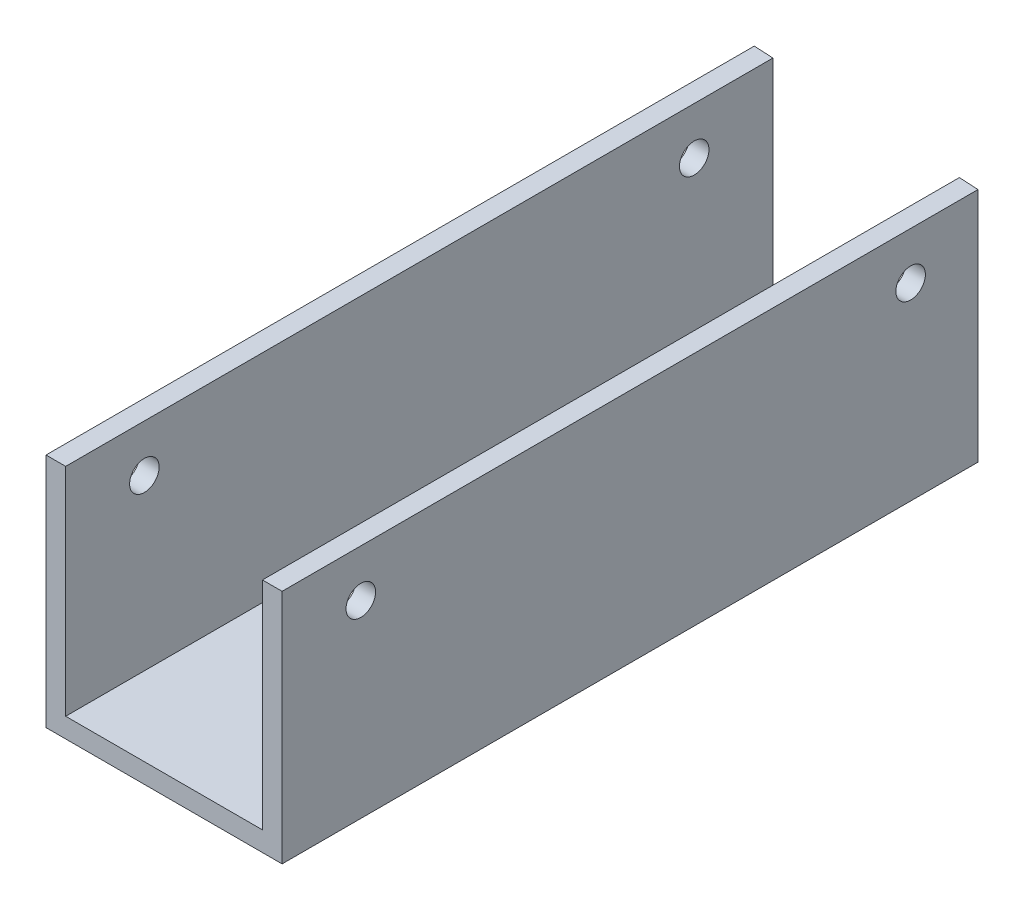
ISO-10303-21;
HEADER;
FILE_DESCRIPTION(('STEP AP214'),'2;1');
FILE_NAME('part.step','',(''),(''),'','','');
FILE_SCHEMA(('AUTOMOTIVE_DESIGN { 1 0 10303 214 1 1 1 1 }'));
ENDSEC;
DATA;
#1=APPLICATION_CONTEXT('core data for automotive mechanical design processes');
#2=APPLICATION_PROTOCOL_DEFINITION('international standard','automotive_design',2000,#1);
#3=PRODUCT_CONTEXT('',#1,'mechanical');
#4=PRODUCT('Part','Part','',(#3));
#5=PRODUCT_RELATED_PRODUCT_CATEGORY('part','',(#4));
#6=PRODUCT_DEFINITION_FORMATION('','',#4);
#7=PRODUCT_DEFINITION_CONTEXT('part definition',#1,'design');
#8=PRODUCT_DEFINITION('design','',#6,#7);
#9=PRODUCT_DEFINITION_SHAPE('','',#8);
#10=(LENGTH_UNIT() NAMED_UNIT(*) SI_UNIT(.MILLI.,.METRE.));
#11=(NAMED_UNIT(*) PLANE_ANGLE_UNIT() SI_UNIT($,.RADIAN.));
#12=(NAMED_UNIT(*) SI_UNIT($,.STERADIAN.) SOLID_ANGLE_UNIT());
#13=UNCERTAINTY_MEASURE_WITH_UNIT(LENGTH_MEASURE(1.E-05),#10,'distance_accuracy_value','');
#14=(GEOMETRIC_REPRESENTATION_CONTEXT(3) GLOBAL_UNCERTAINTY_ASSIGNED_CONTEXT((#13)) GLOBAL_UNIT_ASSIGNED_CONTEXT((#10,
#11,#12)) REPRESENTATION_CONTEXT('',''));
#15=CARTESIAN_POINT('',(0.,0.,0.));
#16=DIRECTION('',(0.,0.,1.));
#17=DIRECTION('',(1.,0.,0.));
#18=AXIS2_PLACEMENT_3D('',#15,#16,#17);
#19=CARTESIAN_POINT('',(-16.5537585091626,3.175,114.3));
#20=DIRECTION('',(0.,-1.,0.));
#21=DIRECTION('',(0.,0.,-1.));
#22=AXIS2_PLACEMENT_3D('',#19,#20,#21);
#23=PLANE('',#22);
#24=DIRECTION('',(0.,0.,-1.));
#25=VECTOR('',#24,1.);
#26=CARTESIAN_POINT('',(-16.5537585091626,3.175,114.3));
#27=LINE('',#26,#25);
#28=CARTESIAN_POINT('',(-16.5537585091626,3.175,68.2625));
#29=VERTEX_POINT('',#28);
#30=CARTESIAN_POINT('',(-16.5537585091626,3.175,0.166394699223652));
#31=VERTEX_POINT('',#30);
#32=EDGE_CURVE('E234',#29,#31,#27,.T.);
#33=ORIENTED_EDGE('',*,*,#32,.F.);
#34=DIRECTION('',(-1.,0.,0.));
#35=VECTOR('',#34,1.);
#36=CARTESIAN_POINT('',(-16.5537585091627,3.175,68.2625));
#37=LINE('',#36,#35);
#38=CARTESIAN_POINT('',(15.1962414908374,3.175,68.2625));
#39=VERTEX_POINT('',#38);
#40=EDGE_CURVE('E56',#39,#29,#37,.T.);
#41=ORIENTED_EDGE('',*,*,#40,.F.);
#42=DIRECTION('',(0.,0.,-1.));
#43=VECTOR('',#42,1.);
#44=CARTESIAN_POINT('',(15.1962414908374,3.175,114.3));
#45=LINE('',#44,#43);
#46=CARTESIAN_POINT('',(15.1962414908373,3.175,1.83034169145998));
#47=VERTEX_POINT('',#46);
#48=EDGE_CURVE('E236',#39,#47,#45,.T.);
#49=ORIENTED_EDGE('',*,*,#48,.T.);
#50=DIRECTION('',(-0.998629534754574,0.,-0.0523359562429369));
#51=VECTOR('',#50,1.);
#52=CARTESIAN_POINT('',(-10.5886533245199,3.175,0.479012615140481));
#53=LINE('',#52,#51);
#54=EDGE_CURVE('E196',#47,#31,#53,.T.);
#55=ORIENTED_EDGE('',*,*,#54,.T.);
#56=EDGE_LOOP('',(#33,#41,#49,#55));
#57=FACE_BOUND('',#56,.T.);
#58=ADVANCED_FACE('F39',(#57),#23,.F.);
#59=CARTESIAN_POINT('',(18.3712414908373,38.1,114.3));
#60=DIRECTION('',(-1.,0.,0.));
#61=DIRECTION('',(0.,-1.,0.));
#62=AXIS2_PLACEMENT_3D('',#59,#60,#61);
#63=PLANE('',#62);
#64=CARTESIAN_POINT('',(18.3712414908373,30.48,12.8663946992236));
#65=DIRECTION('',(1.,0.,0.));
#66=DIRECTION('',(0.,1.,0.));
#67=AXIS2_PLACEMENT_3D('',#64,#65,#66);
#68=CIRCLE('',#67,2.38125);
#69=CARTESIAN_POINT('',(18.3712414908373,32.86125,12.8663946992236));
#70=VERTEX_POINT('',#69);
#71=EDGE_CURVE('E166',#70,#70,#68,.T.);
#72=ORIENTED_EDGE('',*,*,#71,.F.);
#73=EDGE_LOOP('',(#72));
#74=FACE_BOUND('',#73,.T.);
#75=CARTESIAN_POINT('',(18.3712414908373,30.48,101.6));
#76=DIRECTION('',(1.,0.,0.));
#77=DIRECTION('',(0.,1.,0.));
#78=AXIS2_PLACEMENT_3D('',#75,#76,#77);
#79=CIRCLE('',#78,2.38125000000001);
#80=CARTESIAN_POINT('',(18.3712414908373,32.86125,101.6));
#81=VERTEX_POINT('',#80);
#82=EDGE_CURVE('E162',#81,#81,#79,.T.);
#83=ORIENTED_EDGE('',*,*,#82,.F.);
#84=EDGE_LOOP('',(#83));
#85=FACE_BOUND('',#84,.T.);
#86=DIRECTION('',(0.,0.,-1.));
#87=VECTOR('',#86,1.);
#88=CARTESIAN_POINT('',(18.3712414908374,0.,114.3));
#89=LINE('',#88,#87);
#90=CARTESIAN_POINT('',(18.3712414908374,0.,114.3));
#91=VERTEX_POINT('',#90);
#92=CARTESIAN_POINT('',(18.3712414908373,0.,1.9967363906836));
#93=VERTEX_POINT('',#92);
#94=EDGE_CURVE('E220',#91,#93,#89,.T.);
#95=ORIENTED_EDGE('',*,*,#94,.T.);
#96=DIRECTION('',(0.,1.,0.));
#97=VECTOR('',#96,1.);
#98=CARTESIAN_POINT('',(18.3712414908373,-60.325,1.9967363906836));
#99=LINE('',#98,#97);
#100=CARTESIAN_POINT('',(18.3712414908373,38.1,1.9967363906836));
#101=VERTEX_POINT('',#100);
#102=EDGE_CURVE('E187',#93,#101,#99,.T.);
#103=ORIENTED_EDGE('',*,*,#102,.T.);
#104=DIRECTION('',(0.,0.,-1.));
#105=VECTOR('',#104,1.);
#106=CARTESIAN_POINT('',(18.3712414908373,38.1,114.3));
#107=LINE('',#106,#105);
#108=CARTESIAN_POINT('',(18.3712414908373,38.1,114.3));
#109=VERTEX_POINT('',#108);
#110=EDGE_CURVE('E11',#109,#101,#107,.T.);
#111=ORIENTED_EDGE('',*,*,#110,.F.);
#112=DIRECTION('',(0.,1.,0.));
#113=VECTOR('',#112,1.);
#114=CARTESIAN_POINT('',(18.3712414908373,38.1,114.3));
#115=LINE('',#114,#113);
#116=EDGE_CURVE('E203',#91,#109,#115,.T.);
#117=ORIENTED_EDGE('',*,*,#116,.F.);
#118=EDGE_LOOP('',(#95,#103,#111,#117));
#119=FACE_BOUND('',#118,.T.);
#120=ADVANCED_FACE('F41',(#74,#85,#119),#63,.F.);
#121=CARTESIAN_POINT('',(15.1962414908374,38.1,114.3));
#122=DIRECTION('',(0.,-1.,0.));
#123=DIRECTION('',(0.,0.,-1.));
#124=AXIS2_PLACEMENT_3D('',#121,#122,#123);
#125=PLANE('',#124);
#126=ORIENTED_EDGE('',*,*,#110,.T.);
#127=DIRECTION('',(0.998629534754574,0.,0.0523359562429369));
#128=VECTOR('',#127,1.);
#129=CARTESIAN_POINT('',(18.3712414908373,38.1,1.9967363906836));
#130=LINE('',#129,#128);
#131=CARTESIAN_POINT('',(15.1962414908374,38.1,1.83034169145997));
#132=VERTEX_POINT('',#131);
#133=EDGE_CURVE('E184',#132,#101,#130,.T.);
#134=ORIENTED_EDGE('',*,*,#133,.F.);
#135=DIRECTION('',(0.,0.,-1.));
#136=VECTOR('',#135,1.);
#137=CARTESIAN_POINT('',(15.1962414908374,38.1,114.3));
#138=LINE('',#137,#136);
#139=CARTESIAN_POINT('',(15.1962414908374,38.1,114.3));
#140=VERTEX_POINT('',#139);
#141=EDGE_CURVE('E48',#140,#132,#138,.T.);
#142=ORIENTED_EDGE('',*,*,#141,.F.);
#143=DIRECTION('',(-1.,0.,0.));
#144=VECTOR('',#143,1.);
#145=CARTESIAN_POINT('',(15.1962414908374,38.1,114.3));
#146=LINE('',#145,#144);
#147=EDGE_CURVE('E206',#109,#140,#146,.T.);
#148=ORIENTED_EDGE('',*,*,#147,.F.);
#149=EDGE_LOOP('',(#126,#134,#142,#148));
#150=FACE_BOUND('',#149,.T.);
#151=ADVANCED_FACE('F278',(#150),#125,.F.);
#152=CARTESIAN_POINT('',(15.1962414908374,3.175,114.3));
#153=DIRECTION('',(1.,0.,0.));
#154=DIRECTION('',(0.,0.,-1.));
#155=AXIS2_PLACEMENT_3D('',#152,#153,#154);
#156=PLANE('',#155);
#157=CARTESIAN_POINT('',(15.1962414908374,30.48,12.8663946992236));
#158=DIRECTION('',(1.,0.,0.));
#159=DIRECTION('',(0.,0.,-1.));
#160=AXIS2_PLACEMENT_3D('',#157,#158,#159);
#161=CIRCLE('',#160,2.38125);
#162=CARTESIAN_POINT('',(15.1962414908374,30.48,10.4851446992236));
#163=VERTEX_POINT('',#162);
#164=EDGE_CURVE('E181',#163,#163,#161,.T.);
#165=ORIENTED_EDGE('',*,*,#164,.T.);
#166=EDGE_LOOP('',(#165));
#167=FACE_BOUND('',#166,.T.);
#168=CARTESIAN_POINT('',(15.1962414908374,30.48,101.6));
#169=DIRECTION('',(1.,0.,0.));
#170=DIRECTION('',(0.,0.,-1.));
#171=AXIS2_PLACEMENT_3D('',#168,#169,#170);
#172=CIRCLE('',#171,2.38125000000001);
#173=CARTESIAN_POINT('',(15.1962414908374,30.48,99.21875));
#174=VERTEX_POINT('',#173);
#175=EDGE_CURVE('E175',#174,#174,#172,.T.);
#176=ORIENTED_EDGE('',*,*,#175,.T.);
#177=EDGE_LOOP('',(#176));
#178=FACE_BOUND('',#177,.T.);
#179=ORIENTED_EDGE('',*,*,#141,.T.);
#180=DIRECTION('',(0.,-1.,0.));
#181=VECTOR('',#180,1.);
#182=CARTESIAN_POINT('',(15.1962414908374,3.175,1.83034169145999));
#183=LINE('',#182,#181);
#184=EDGE_CURVE('E199',#132,#47,#183,.T.);
#185=ORIENTED_EDGE('',*,*,#184,.T.);
#186=ORIENTED_EDGE('',*,*,#48,.F.);
#187=DIRECTION('',(0.,1.,0.));
#188=VECTOR('',#187,1.);
#189=CARTESIAN_POINT('',(15.1962414908374,0.,68.2625));
#190=LINE('',#189,#188);
#191=CARTESIAN_POINT('',(15.1962414908374,0.,68.2625));
#192=VERTEX_POINT('',#191);
#193=EDGE_CURVE('E163',#192,#39,#190,.T.);
#194=ORIENTED_EDGE('',*,*,#193,.F.);
#195=DIRECTION('',(0.,0.,-1.));
#196=VECTOR('',#195,1.);
#197=CARTESIAN_POINT('',(15.1962414908374,0.,68.2625));
#198=LINE('',#197,#196);
#199=CARTESIAN_POINT('',(15.1962414908374,0.,76.2));
#200=VERTEX_POINT('',#199);
#201=EDGE_CURVE('E64',#200,#192,#198,.T.);
#202=ORIENTED_EDGE('',*,*,#201,.F.);
#203=DIRECTION('',(0.,1.,0.));
#204=VECTOR('',#203,1.);
#205=CARTESIAN_POINT('',(15.1962414908374,0.,76.2));
#206=LINE('',#205,#204);
#207=CARTESIAN_POINT('',(15.1962414908374,3.175,76.2));
#208=VERTEX_POINT('',#207);
#209=EDGE_CURVE('E142',#200,#208,#206,.T.);
#210=ORIENTED_EDGE('',*,*,#209,.T.);
#211=CARTESIAN_POINT('',(15.1962414908374,3.175,114.3));
#212=VERTEX_POINT('',#211);
#213=EDGE_CURVE('E237',#212,#208,#45,.T.);
#214=ORIENTED_EDGE('',*,*,#213,.F.);
#215=DIRECTION('',(0.,-1.,0.));
#216=VECTOR('',#215,1.);
#217=CARTESIAN_POINT('',(15.1962414908374,3.175,114.3));
#218=LINE('',#217,#216);
#219=EDGE_CURVE('E208',#140,#212,#218,.T.);
#220=ORIENTED_EDGE('',*,*,#219,.F.);
#221=EDGE_LOOP('',(#179,#185,#186,#194,#202,#210,#214,#220));
#222=FACE_BOUND('',#221,.T.);
#223=ADVANCED_FACE('F268',(#167,#178,#222),#156,.F.);
#224=ORIENTED_EDGE('',*,*,#213,.T.);
#225=DIRECTION('',(1.,0.,0.));
#226=VECTOR('',#225,1.);
#227=CARTESIAN_POINT('',(-16.5537585091627,3.175,76.2));
#228=LINE('',#227,#226);
#229=CARTESIAN_POINT('',(-16.5537585091627,3.175,76.2));
#230=VERTEX_POINT('',#229);
#231=EDGE_CURVE('E154',#230,#208,#228,.T.);
#232=ORIENTED_EDGE('',*,*,#231,.F.);
#233=CARTESIAN_POINT('',(-16.5537585091626,3.175,114.3));
#234=VERTEX_POINT('',#233);
#235=EDGE_CURVE('E138',#234,#230,#27,.T.);
#236=ORIENTED_EDGE('',*,*,#235,.F.);
#237=DIRECTION('',(-1.,0.,0.));
#238=VECTOR('',#237,1.);
#239=CARTESIAN_POINT('',(-16.5537585091626,3.175,114.3));
#240=LINE('',#239,#238);
#241=EDGE_CURVE('E210',#212,#234,#240,.T.);
#242=ORIENTED_EDGE('',*,*,#241,.F.);
#243=EDGE_LOOP('',(#224,#232,#236,#242));
#244=FACE_BOUND('',#243,.T.);
#245=ADVANCED_FACE('F258',(#244),#23,.F.);
#246=CARTESIAN_POINT('',(-16.5537585091627,38.1,114.3));
#247=DIRECTION('',(-1.,0.,0.));
#248=DIRECTION('',(0.,-1.,0.));
#249=AXIS2_PLACEMENT_3D('',#246,#247,#248);
#250=PLANE('',#249);
#251=CARTESIAN_POINT('',(-16.5537585091627,30.48,12.8663946992236));
#252=DIRECTION('',(-1.,0.,0.));
#253=DIRECTION('',(0.,-1.,0.));
#254=AXIS2_PLACEMENT_3D('',#251,#252,#253);
#255=CIRCLE('',#254,2.38125);
#256=CARTESIAN_POINT('',(-16.5537585091627,28.09875,12.8663946992236));
#257=VERTEX_POINT('',#256);
#258=EDGE_CURVE('E178',#257,#257,#255,.T.);
#259=ORIENTED_EDGE('',*,*,#258,.T.);
#260=EDGE_LOOP('',(#259));
#261=FACE_BOUND('',#260,.T.);
#262=CARTESIAN_POINT('',(-16.5537585091627,30.48,101.6));
#263=DIRECTION('',(-1.,0.,0.));
#264=DIRECTION('',(0.,-1.,0.));
#265=AXIS2_PLACEMENT_3D('',#262,#263,#264);
#266=CIRCLE('',#265,2.38125000000001);
#267=CARTESIAN_POINT('',(-16.5537585091627,28.09875,101.6));
#268=VERTEX_POINT('',#267);
#269=EDGE_CURVE('E172',#268,#268,#266,.T.);
#270=ORIENTED_EDGE('',*,*,#269,.T.);
#271=EDGE_LOOP('',(#270));
#272=FACE_BOUND('',#271,.T.);
#273=ORIENTED_EDGE('',*,*,#235,.T.);
#274=DIRECTION('',(0.,1.,0.));
#275=VECTOR('',#274,1.);
#276=CARTESIAN_POINT('',(-16.5537585091627,0.,76.2));
#277=LINE('',#276,#275);
#278=CARTESIAN_POINT('',(-16.5537585091627,0.,76.2));
#279=VERTEX_POINT('',#278);
#280=EDGE_CURVE('E130',#279,#230,#277,.T.);
#281=ORIENTED_EDGE('',*,*,#280,.F.);
#282=DIRECTION('',(0.,0.,1.));
#283=VECTOR('',#282,1.);
#284=CARTESIAN_POINT('',(-16.5537585091627,0.,68.2625));
#285=LINE('',#284,#283);
#286=CARTESIAN_POINT('',(-16.5537585091627,0.,68.2625));
#287=VERTEX_POINT('',#286);
#288=EDGE_CURVE('E134',#287,#279,#285,.T.);
#289=ORIENTED_EDGE('',*,*,#288,.F.);
#290=DIRECTION('',(0.,1.,0.));
#291=VECTOR('',#290,1.);
#292=CARTESIAN_POINT('',(-16.5537585091627,0.,68.2625));
#293=LINE('',#292,#291);
#294=EDGE_CURVE('E160',#287,#29,#293,.T.);
#295=ORIENTED_EDGE('',*,*,#294,.T.);
#296=ORIENTED_EDGE('',*,*,#32,.T.);
#297=DIRECTION('',(0.,1.,0.));
#298=VECTOR('',#297,1.);
#299=CARTESIAN_POINT('',(-16.5537585091627,38.1,0.166394699223651));
#300=LINE('',#299,#298);
#301=CARTESIAN_POINT('',(-16.5537585091627,38.1,0.166394699223634));
#302=VERTEX_POINT('',#301);
#303=EDGE_CURVE('E193',#31,#302,#300,.T.);
#304=ORIENTED_EDGE('',*,*,#303,.T.);
#305=DIRECTION('',(0.,0.,-1.));
#306=VECTOR('',#305,1.);
#307=CARTESIAN_POINT('',(-16.5537585091627,38.1,114.3));
#308=LINE('',#307,#306);
#309=CARTESIAN_POINT('',(-16.5537585091627,38.1,114.3));
#310=VERTEX_POINT('',#309);
#311=EDGE_CURVE('E231',#310,#302,#308,.T.);
#312=ORIENTED_EDGE('',*,*,#311,.F.);
#313=DIRECTION('',(0.,1.,0.));
#314=VECTOR('',#313,1.);
#315=CARTESIAN_POINT('',(-16.5537585091627,38.1,114.3));
#316=LINE('',#315,#314);
#317=EDGE_CURVE('E212',#234,#310,#316,.T.);
#318=ORIENTED_EDGE('',*,*,#317,.F.);
#319=EDGE_LOOP('',(#273,#281,#289,#295,#296,#304,#312,#318));
#320=FACE_BOUND('',#319,.T.);
#321=ADVANCED_FACE('F132',(#261,#272,#320),#250,.F.);
#322=CARTESIAN_POINT('',(-19.7287585091627,38.1,114.3));
#323=DIRECTION('',(0.,-1.,0.));
#324=DIRECTION('',(0.,0.,-1.));
#325=AXIS2_PLACEMENT_3D('',#322,#323,#324);
#326=PLANE('',#325);
#327=ORIENTED_EDGE('',*,*,#311,.T.);
#328=CARTESIAN_POINT('',(-19.7287585091627,38.1,0.));
#329=VERTEX_POINT('',#328);
#330=EDGE_CURVE('E185',#329,#302,#130,.T.);
#331=ORIENTED_EDGE('',*,*,#330,.F.);
#332=DIRECTION('',(0.,0.,-1.));
#333=VECTOR('',#332,1.);
#334=CARTESIAN_POINT('',(-19.7287585091627,38.1,114.3));
#335=LINE('',#334,#333);
#336=CARTESIAN_POINT('',(-19.7287585091627,38.1,114.3));
#337=VERTEX_POINT('',#336);
#338=EDGE_CURVE('E228',#337,#329,#335,.T.);
#339=ORIENTED_EDGE('',*,*,#338,.F.);
#340=DIRECTION('',(-1.,0.,0.));
#341=VECTOR('',#340,1.);
#342=CARTESIAN_POINT('',(-19.7287585091627,38.1,114.3));
#343=LINE('',#342,#341);
#344=EDGE_CURVE('E214',#310,#337,#343,.T.);
#345=ORIENTED_EDGE('',*,*,#344,.F.);
#346=EDGE_LOOP('',(#327,#331,#339,#345));
#347=FACE_BOUND('',#346,.T.);
#348=ADVANCED_FACE('F257',(#347),#326,.F.);
#349=CARTESIAN_POINT('',(-19.7287585091627,0.,114.3));
#350=DIRECTION('',(1.,0.,0.));
#351=DIRECTION('',(0.,0.,-1.));
#352=AXIS2_PLACEMENT_3D('',#349,#350,#351);
#353=PLANE('',#352);
#354=CARTESIAN_POINT('',(-19.7287585091627,30.48,12.8663946992236));
#355=DIRECTION('',(1.,0.,0.));
#356=DIRECTION('',(0.,0.,-1.));
#357=AXIS2_PLACEMENT_3D('',#354,#355,#356);
#358=CIRCLE('',#357,2.38125);
#359=CARTESIAN_POINT('',(-19.7287585091627,30.48,10.4851446992236));
#360=VERTEX_POINT('',#359);
#361=EDGE_CURVE('E43',#360,#360,#358,.T.);
#362=ORIENTED_EDGE('',*,*,#361,.T.);
#363=EDGE_LOOP('',(#362));
#364=FACE_BOUND('',#363,.T.);
#365=CARTESIAN_POINT('',(-19.7287585091627,30.48,101.6));
#366=DIRECTION('',(1.,0.,0.));
#367=DIRECTION('',(0.,0.,-1.));
#368=AXIS2_PLACEMENT_3D('',#365,#366,#367);
#369=CIRCLE('',#368,2.38125000000001);
#370=CARTESIAN_POINT('',(-19.7287585091627,30.48,99.21875));
#371=VERTEX_POINT('',#370);
#372=EDGE_CURVE('E169',#371,#371,#369,.T.);
#373=ORIENTED_EDGE('',*,*,#372,.T.);
#374=EDGE_LOOP('',(#373));
#375=FACE_BOUND('',#374,.T.);
#376=DIRECTION('',(0.,-1.,0.));
#377=VECTOR('',#376,1.);
#378=CARTESIAN_POINT('',(-19.7287585091627,0.,0.));
#379=LINE('',#378,#377);
#380=CARTESIAN_POINT('',(-19.7287585091627,0.,0.));
#381=VERTEX_POINT('',#380);
#382=EDGE_CURVE('E202',#329,#381,#379,.T.);
#383=ORIENTED_EDGE('',*,*,#382,.T.);
#384=DIRECTION('',(0.,0.,-1.));
#385=VECTOR('',#384,1.);
#386=CARTESIAN_POINT('',(-19.7287585091627,0.,114.3));
#387=LINE('',#386,#385);
#388=CARTESIAN_POINT('',(-19.7287585091627,0.,114.3));
#389=VERTEX_POINT('',#388);
#390=EDGE_CURVE('E225',#389,#381,#387,.T.);
#391=ORIENTED_EDGE('',*,*,#390,.F.);
#392=DIRECTION('',(0.,-1.,0.));
#393=VECTOR('',#392,1.);
#394=CARTESIAN_POINT('',(-19.7287585091627,0.,114.3));
#395=LINE('',#394,#393);
#396=EDGE_CURVE('E216',#337,#389,#395,.T.);
#397=ORIENTED_EDGE('',*,*,#396,.F.);
#398=ORIENTED_EDGE('',*,*,#338,.T.);
#399=EDGE_LOOP('',(#383,#391,#397,#398));
#400=FACE_BOUND('',#399,.T.);
#401=ADVANCED_FACE('F244',(#364,#375,#400),#353,.F.);
#402=CARTESIAN_POINT('',(18.3712414908374,0.,114.3));
#403=DIRECTION('',(0.,1.,0.));
#404=DIRECTION('',(-1.,0.,0.));
#405=AXIS2_PLACEMENT_3D('',#402,#403,#404);
#406=PLANE('',#405);
#407=DIRECTION('',(-1.,0.,0.));
#408=VECTOR('',#407,1.);
#409=CARTESIAN_POINT('',(-16.5537585091627,0.,68.2625));
#410=LINE('',#409,#408);
#411=EDGE_CURVE('E143',#192,#287,#410,.T.);
#412=ORIENTED_EDGE('',*,*,#411,.T.);
#413=ORIENTED_EDGE('',*,*,#288,.T.);
#414=DIRECTION('',(1.,0.,0.));
#415=VECTOR('',#414,1.);
#416=CARTESIAN_POINT('',(-16.5537585091627,0.,76.2));
#417=LINE('',#416,#415);
#418=EDGE_CURVE('E146',#279,#200,#417,.T.);
#419=ORIENTED_EDGE('',*,*,#418,.T.);
#420=ORIENTED_EDGE('',*,*,#201,.T.);
#421=EDGE_LOOP('',(#412,#413,#419,#420));
#422=FACE_BOUND('',#421,.T.);
#423=ORIENTED_EDGE('',*,*,#390,.T.);
#424=DIRECTION('',(0.998629534754574,0.,0.0523359562429369));
#425=VECTOR('',#424,1.);
#426=CARTESIAN_POINT('',(24.2406852733486,0.,2.30434090495163));
#427=LINE('',#426,#425);
#428=EDGE_CURVE('E190',#381,#93,#427,.T.);
#429=ORIENTED_EDGE('',*,*,#428,.T.);
#430=ORIENTED_EDGE('',*,*,#94,.F.);
#431=DIRECTION('',(1.,0.,0.));
#432=VECTOR('',#431,1.);
#433=CARTESIAN_POINT('',(18.3712414908374,0.,114.3));
#434=LINE('',#433,#432);
#435=EDGE_CURVE('E218',#389,#91,#434,.T.);
#436=ORIENTED_EDGE('',*,*,#435,.F.);
#437=EDGE_LOOP('',(#423,#429,#430,#436));
#438=FACE_BOUND('',#437,.T.);
#439=ADVANCED_FACE('F150',(#422,#438),#406,.F.);
#440=CARTESIAN_POINT('',(0.,0.,114.3));
#441=DIRECTION('',(0.,0.,-1.));
#442=DIRECTION('',(-1.,0.,0.));
#443=AXIS2_PLACEMENT_3D('',#440,#441,#442);
#444=PLANE('',#443);
#445=ORIENTED_EDGE('',*,*,#116,.T.);
#446=ORIENTED_EDGE('',*,*,#147,.T.);
#447=ORIENTED_EDGE('',*,*,#219,.T.);
#448=ORIENTED_EDGE('',*,*,#241,.T.);
#449=ORIENTED_EDGE('',*,*,#317,.T.);
#450=ORIENTED_EDGE('',*,*,#344,.T.);
#451=ORIENTED_EDGE('',*,*,#396,.T.);
#452=ORIENTED_EDGE('',*,*,#435,.T.);
#453=EDGE_LOOP('',(#445,#446,#447,#448,#449,#450,#451,#452));
#454=FACE_BOUND('',#453,.T.);
#455=ADVANCED_FACE('F309',(#454),#444,.F.);
#456=CARTESIAN_POINT('',(18.3712414908373,-60.325,1.9967363906836));
#457=DIRECTION('',(-0.0523359562429369,0.,0.998629534754574));
#458=DIRECTION('',(0.998629534754574,0.,0.0523359562429369));
#459=AXIS2_PLACEMENT_3D('',#456,#457,#458);
#460=PLANE('',#459);
#461=ORIENTED_EDGE('',*,*,#133,.T.);
#462=ORIENTED_EDGE('',*,*,#102,.F.);
#463=ORIENTED_EDGE('',*,*,#428,.F.);
#464=ORIENTED_EDGE('',*,*,#382,.F.);
#465=ORIENTED_EDGE('',*,*,#330,.T.);
#466=ORIENTED_EDGE('',*,*,#303,.F.);
#467=ORIENTED_EDGE('',*,*,#54,.F.);
#468=ORIENTED_EDGE('',*,*,#184,.F.);
#469=EDGE_LOOP('',(#461,#462,#463,#464,#465,#466,#467,#468));
#470=FACE_BOUND('',#469,.T.);
#471=ADVANCED_FACE('F251',(#470),#460,.F.);
#472=CARTESIAN_POINT('',(-80.0537585091627,30.48,101.6));
#473=DIRECTION('',(1.,0.,0.));
#474=DIRECTION('',(0.,1.,0.));
#475=AXIS2_PLACEMENT_3D('',#472,#473,#474);
#476=CYLINDRICAL_SURFACE('',#475,2.38125000000001);
#477=ORIENTED_EDGE('',*,*,#372,.F.);
#478=EDGE_LOOP('',(#477));
#479=FACE_BOUND('',#478,.T.);
#480=ORIENTED_EDGE('',*,*,#269,.F.);
#481=EDGE_LOOP('',(#480));
#482=FACE_BOUND('',#481,.T.);
#483=ADVANCED_FACE('F247',(#479,#482),#476,.F.);
#484=CARTESIAN_POINT('',(-80.0537585091627,30.48,12.8663946992236));
#485=DIRECTION('',(1.,0.,0.));
#486=DIRECTION('',(0.,1.,0.));
#487=AXIS2_PLACEMENT_3D('',#484,#485,#486);
#488=CYLINDRICAL_SURFACE('',#487,2.38125);
#489=ORIENTED_EDGE('',*,*,#361,.F.);
#490=EDGE_LOOP('',(#489));
#491=FACE_BOUND('',#490,.T.);
#492=ORIENTED_EDGE('',*,*,#258,.F.);
#493=EDGE_LOOP('',(#492));
#494=FACE_BOUND('',#493,.T.);
#495=ADVANCED_FACE('F250',(#491,#494),#488,.F.);
#496=ORIENTED_EDGE('',*,*,#82,.T.);
#497=EDGE_LOOP('',(#496));
#498=FACE_BOUND('',#497,.T.);
#499=ORIENTED_EDGE('',*,*,#175,.F.);
#500=EDGE_LOOP('',(#499));
#501=FACE_BOUND('',#500,.T.);
#502=ADVANCED_FACE('F253',(#498,#501),#476,.F.);
#503=ORIENTED_EDGE('',*,*,#71,.T.);
#504=EDGE_LOOP('',(#503));
#505=FACE_BOUND('',#504,.T.);
#506=ORIENTED_EDGE('',*,*,#164,.F.);
#507=EDGE_LOOP('',(#506));
#508=FACE_BOUND('',#507,.T.);
#509=ADVANCED_FACE('F327',(#505,#508),#488,.F.);
#510=CARTESIAN_POINT('',(-16.5537585091627,0.,68.2625));
#511=DIRECTION('',(0.,0.,-1.));
#512=DIRECTION('',(-1.,0.,0.));
#513=AXIS2_PLACEMENT_3D('',#510,#511,#512);
#514=PLANE('',#513);
#515=ORIENTED_EDGE('',*,*,#40,.T.);
#516=ORIENTED_EDGE('',*,*,#294,.F.);
#517=ORIENTED_EDGE('',*,*,#411,.F.);
#518=ORIENTED_EDGE('',*,*,#193,.T.);
#519=EDGE_LOOP('',(#515,#516,#517,#518));
#520=FACE_BOUND('',#519,.T.);
#521=ADVANCED_FACE('F334',(#520),#514,.F.);
#522=CARTESIAN_POINT('',(-16.5537585091627,0.,76.2));
#523=DIRECTION('',(0.,0.,1.));
#524=DIRECTION('',(1.,0.,0.));
#525=AXIS2_PLACEMENT_3D('',#522,#523,#524);
#526=PLANE('',#525);
#527=ORIENTED_EDGE('',*,*,#231,.T.);
#528=ORIENTED_EDGE('',*,*,#209,.F.);
#529=ORIENTED_EDGE('',*,*,#418,.F.);
#530=ORIENTED_EDGE('',*,*,#280,.T.);
#531=EDGE_LOOP('',(#527,#528,#529,#530));
#532=FACE_BOUND('',#531,.T.);
#533=ADVANCED_FACE('F147',(#532),#526,.F.);
#534=CLOSED_SHELL('',(#58,#120,#151,#223,#245,#321,#348,#401,#439,#455,#471,#483,#495,#502,#509,
#521,#533));
#535=MANIFOLD_SOLID_BREP('B2',#534);
#536=ADVANCED_BREP_SHAPE_REPRESENTATION('',(#18,#535),#14);
#537=SHAPE_DEFINITION_REPRESENTATION(#9,#536);
ENDSEC;
END-ISO-10303-21;
